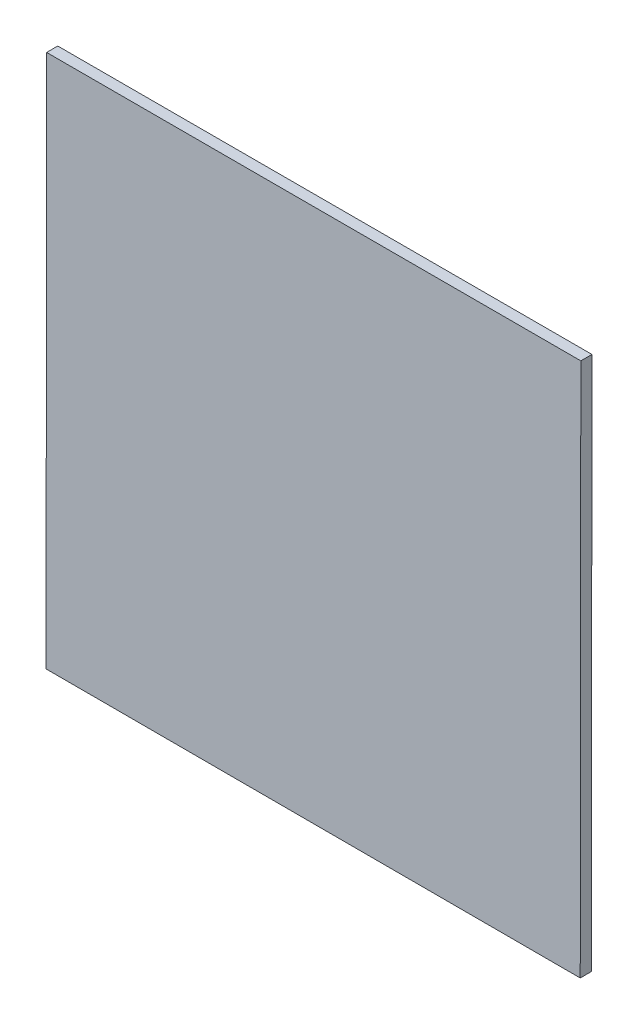
ISO-10303-21;
HEADER;
FILE_DESCRIPTION(('STEP AP214'),'2;1');
FILE_NAME('part.step','',(''),(''),'','','');
FILE_SCHEMA(('AUTOMOTIVE_DESIGN { 1 0 10303 214 1 1 1 1 }'));
ENDSEC;
DATA;
#1=APPLICATION_CONTEXT('core data for automotive mechanical design processes');
#2=APPLICATION_PROTOCOL_DEFINITION('international standard','automotive_design',2000,#1);
#3=PRODUCT_CONTEXT('',#1,'mechanical');
#4=PRODUCT('Part','Part','',(#3));
#5=PRODUCT_RELATED_PRODUCT_CATEGORY('part','',(#4));
#6=PRODUCT_DEFINITION_FORMATION('','',#4);
#7=PRODUCT_DEFINITION_CONTEXT('part definition',#1,'design');
#8=PRODUCT_DEFINITION('design','',#6,#7);
#9=PRODUCT_DEFINITION_SHAPE('','',#8);
#10=(LENGTH_UNIT() NAMED_UNIT(*) SI_UNIT(.MILLI.,.METRE.));
#11=(NAMED_UNIT(*) PLANE_ANGLE_UNIT() SI_UNIT($,.RADIAN.));
#12=(NAMED_UNIT(*) SI_UNIT($,.STERADIAN.) SOLID_ANGLE_UNIT());
#13=UNCERTAINTY_MEASURE_WITH_UNIT(LENGTH_MEASURE(1.E-05),#10,'distance_accuracy_value','');
#14=(GEOMETRIC_REPRESENTATION_CONTEXT(3) GLOBAL_UNCERTAINTY_ASSIGNED_CONTEXT((#13)) GLOBAL_UNIT_ASSIGNED_CONTEXT((#10,
#11,#12)) REPRESENTATION_CONTEXT('',''));
#15=CARTESIAN_POINT('',(0.,0.,0.));
#16=DIRECTION('',(0.,0.,1.));
#17=DIRECTION('',(1.,0.,0.));
#18=AXIS2_PLACEMENT_3D('',#15,#16,#17);
#19=CARTESIAN_POINT('',(3573.31515659306,-3.90584952707153,76.2));
#20=DIRECTION('',(-0.999999402609945,0.00109305981213251,0.));
#21=DIRECTION('',(-0.00109305981213251,-0.999999402609945,0.));
#22=AXIS2_PLACEMENT_3D('',#19,#20,#21);
#23=PLANE('',#22);
#24=DIRECTION('',(0.00109305981213251,0.999999402609945,0.));
#25=VECTOR('',#24,1.);
#26=CARTESIAN_POINT('',(3573.31515659306,-3.90584952707153,0.));
#27=LINE('',#26,#25);
#28=CARTESIAN_POINT('',(3569.48122724759,-3511.42393093953,0.));
#29=VERTEX_POINT('',#28);
#30=CARTESIAN_POINT('',(3573.48357523645,150.174047017675,0.));
#31=VERTEX_POINT('',#30);
#32=EDGE_CURVE('E98',#29,#31,#27,.T.);
#33=ORIENTED_EDGE('',*,*,#32,.T.);
#34=DIRECTION('',(0.,0.,-1.));
#35=VECTOR('',#34,1.);
#36=CARTESIAN_POINT('',(3573.48357523645,150.174047017675,76.2));
#37=LINE('',#36,#35);
#38=CARTESIAN_POINT('',(3573.48357523645,150.174047017675,76.2));
#39=VERTEX_POINT('',#38);
#40=EDGE_CURVE('E11',#39,#31,#37,.T.);
#41=ORIENTED_EDGE('',*,*,#40,.F.);
#42=DIRECTION('',(0.00109305981213251,0.999999402609945,0.));
#43=VECTOR('',#42,1.);
#44=CARTESIAN_POINT('',(3573.31515659306,-3.90584952707153,76.2));
#45=LINE('',#44,#43);
#46=CARTESIAN_POINT('',(3569.48122724759,-3511.42393093953,76.2));
#47=VERTEX_POINT('',#46);
#48=EDGE_CURVE('E86',#47,#39,#45,.T.);
#49=ORIENTED_EDGE('',*,*,#48,.F.);
#50=DIRECTION('',(0.,0.,-1.));
#51=VECTOR('',#50,1.);
#52=CARTESIAN_POINT('',(3569.48122724759,-3511.42393093953,76.2));
#53=LINE('',#52,#51);
#54=EDGE_CURVE('E94',#47,#29,#53,.T.);
#55=ORIENTED_EDGE('',*,*,#54,.T.);
#56=EDGE_LOOP('',(#33,#41,#49,#55));
#57=FACE_BOUND('',#56,.T.);
#58=ADVANCED_FACE('F35',(#57),#23,.F.);
#59=CARTESIAN_POINT('',(0.,150.174047017674,76.2));
#60=DIRECTION('',(0.,-1.,0.));
#61=DIRECTION('',(1.,0.,0.));
#62=AXIS2_PLACEMENT_3D('',#59,#60,#61);
#63=PLANE('',#62);
#64=DIRECTION('',(-1.,0.,0.));
#65=VECTOR('',#64,1.);
#66=CARTESIAN_POINT('',(0.,150.174047017674,0.));
#67=LINE('',#66,#65);
#68=CARTESIAN_POINT('',(-84.1207947951981,150.174047017674,0.));
#69=VERTEX_POINT('',#68);
#70=EDGE_CURVE('E90',#31,#69,#67,.T.);
#71=ORIENTED_EDGE('',*,*,#70,.T.);
#72=DIRECTION('',(0.,0.,-1.));
#73=VECTOR('',#72,1.);
#74=CARTESIAN_POINT('',(-84.1207947951981,150.174047017674,76.2));
#75=LINE('',#74,#73);
#76=CARTESIAN_POINT('',(-84.1207947951981,150.174047017674,76.2));
#77=VERTEX_POINT('',#76);
#78=EDGE_CURVE('E43',#77,#69,#75,.T.);
#79=ORIENTED_EDGE('',*,*,#78,.F.);
#80=DIRECTION('',(-1.,0.,0.));
#81=VECTOR('',#80,1.);
#82=CARTESIAN_POINT('',(0.,150.174047017674,76.2));
#83=LINE('',#82,#81);
#84=EDGE_CURVE('E81',#39,#77,#83,.T.);
#85=ORIENTED_EDGE('',*,*,#84,.F.);
#86=ORIENTED_EDGE('',*,*,#40,.T.);
#87=EDGE_LOOP('',(#71,#79,#85,#86));
#88=FACE_BOUND('',#87,.T.);
#89=ADVANCED_FACE('F89',(#88),#63,.F.);
#90=CARTESIAN_POINT('',(-84.2848434069349,0.0921284301366382,76.2));
#91=DIRECTION('',(0.999999402609945,-0.00109305981213284,0.));
#92=DIRECTION('',(0.00109305981213284,0.999999402609945,0.));
#93=AXIS2_PLACEMENT_3D('',#90,#91,#92);
#94=PLANE('',#93);
#95=DIRECTION('',(-0.00109305981213284,-0.999999402609945,0.));
#96=VECTOR('',#95,1.);
#97=CARTESIAN_POINT('',(-84.2848434069349,0.0921284301366382,0.));
#98=LINE('',#97,#96);
#99=CARTESIAN_POINT('',(-88.1187727524074,-3507.42595298233,0.));
#100=VERTEX_POINT('',#99);
#101=EDGE_CURVE('E68',#69,#100,#98,.T.);
#102=ORIENTED_EDGE('',*,*,#101,.T.);
#103=DIRECTION('',(0.,0.,-1.));
#104=VECTOR('',#103,1.);
#105=CARTESIAN_POINT('',(-88.1187727524074,-3507.42595298233,76.2));
#106=LINE('',#105,#104);
#107=CARTESIAN_POINT('',(-88.1187727524074,-3507.42595298233,76.2));
#108=VERTEX_POINT('',#107);
#109=EDGE_CURVE('E91',#108,#100,#106,.T.);
#110=ORIENTED_EDGE('',*,*,#109,.F.);
#111=DIRECTION('',(-0.00109305981213284,-0.999999402609945,0.));
#112=VECTOR('',#111,1.);
#113=CARTESIAN_POINT('',(-84.2848434069349,0.0921284301366382,76.2));
#114=LINE('',#113,#112);
#115=EDGE_CURVE('E84',#77,#108,#114,.T.);
#116=ORIENTED_EDGE('',*,*,#115,.F.);
#117=ORIENTED_EDGE('',*,*,#78,.T.);
#118=EDGE_LOOP('',(#102,#110,#116,#117));
#119=FACE_BOUND('',#118,.T.);
#120=ADVANCED_FACE('F92',(#119),#94,.F.);
#121=CARTESIAN_POINT('',(-3.83392934547177,-3507.51808141246,76.2));
#122=DIRECTION('',(0.00109305981213263,0.999999402609945,0.));
#123=DIRECTION('',(-0.999999402609945,0.00109305981213263,0.));
#124=AXIS2_PLACEMENT_3D('',#121,#122,#123);
#125=PLANE('',#124);
#126=DIRECTION('',(0.999999402609945,-0.00109305981213263,0.));
#127=VECTOR('',#126,1.);
#128=CARTESIAN_POINT('',(-3.83392934547177,-3507.51808141246,0.));
#129=LINE('',#128,#127);
#130=EDGE_CURVE('E74',#100,#29,#129,.T.);
#131=ORIENTED_EDGE('',*,*,#130,.T.);
#132=ORIENTED_EDGE('',*,*,#54,.F.);
#133=DIRECTION('',(0.999999402609945,-0.00109305981213263,0.));
#134=VECTOR('',#133,1.);
#135=CARTESIAN_POINT('',(-3.83392934547177,-3507.51808141246,76.2));
#136=LINE('',#135,#134);
#137=EDGE_CURVE('E51',#108,#47,#136,.T.);
#138=ORIENTED_EDGE('',*,*,#137,.F.);
#139=ORIENTED_EDGE('',*,*,#109,.T.);
#140=EDGE_LOOP('',(#131,#132,#138,#139));
#141=FACE_BOUND('',#140,.T.);
#142=ADVANCED_FACE('F105',(#141),#125,.F.);
#143=CARTESIAN_POINT('',(0.,0.,76.2));
#144=DIRECTION('',(0.,0.,1.));
#145=DIRECTION('',(1.,0.,0.));
#146=AXIS2_PLACEMENT_3D('',#143,#144,#145);
#147=PLANE('',#146);
#148=ORIENTED_EDGE('',*,*,#48,.T.);
#149=ORIENTED_EDGE('',*,*,#84,.T.);
#150=ORIENTED_EDGE('',*,*,#115,.T.);
#151=ORIENTED_EDGE('',*,*,#137,.T.);
#152=EDGE_LOOP('',(#148,#149,#150,#151));
#153=FACE_BOUND('',#152,.T.);
#154=ADVANCED_FACE('F82',(#153),#147,.T.);
#155=CARTESIAN_POINT('',(0.,0.,0.));
#156=DIRECTION('',(0.,0.,1.));
#157=DIRECTION('',(1.,0.,0.));
#158=AXIS2_PLACEMENT_3D('',#155,#156,#157);
#159=PLANE('',#158);
#160=ORIENTED_EDGE('',*,*,#32,.F.);
#161=ORIENTED_EDGE('',*,*,#130,.F.);
#162=ORIENTED_EDGE('',*,*,#101,.F.);
#163=ORIENTED_EDGE('',*,*,#70,.F.);
#164=EDGE_LOOP('',(#160,#161,#162,#163));
#165=FACE_BOUND('',#164,.T.);
#166=ADVANCED_FACE('F108',(#165),#159,.F.);
#167=CLOSED_SHELL('',(#58,#89,#120,#142,#154,#166));
#168=MANIFOLD_SOLID_BREP('B2',#167);
#169=ADVANCED_BREP_SHAPE_REPRESENTATION('',(#18,#168),#14);
#170=SHAPE_DEFINITION_REPRESENTATION(#9,#169);
ENDSEC;
END-ISO-10303-21;
